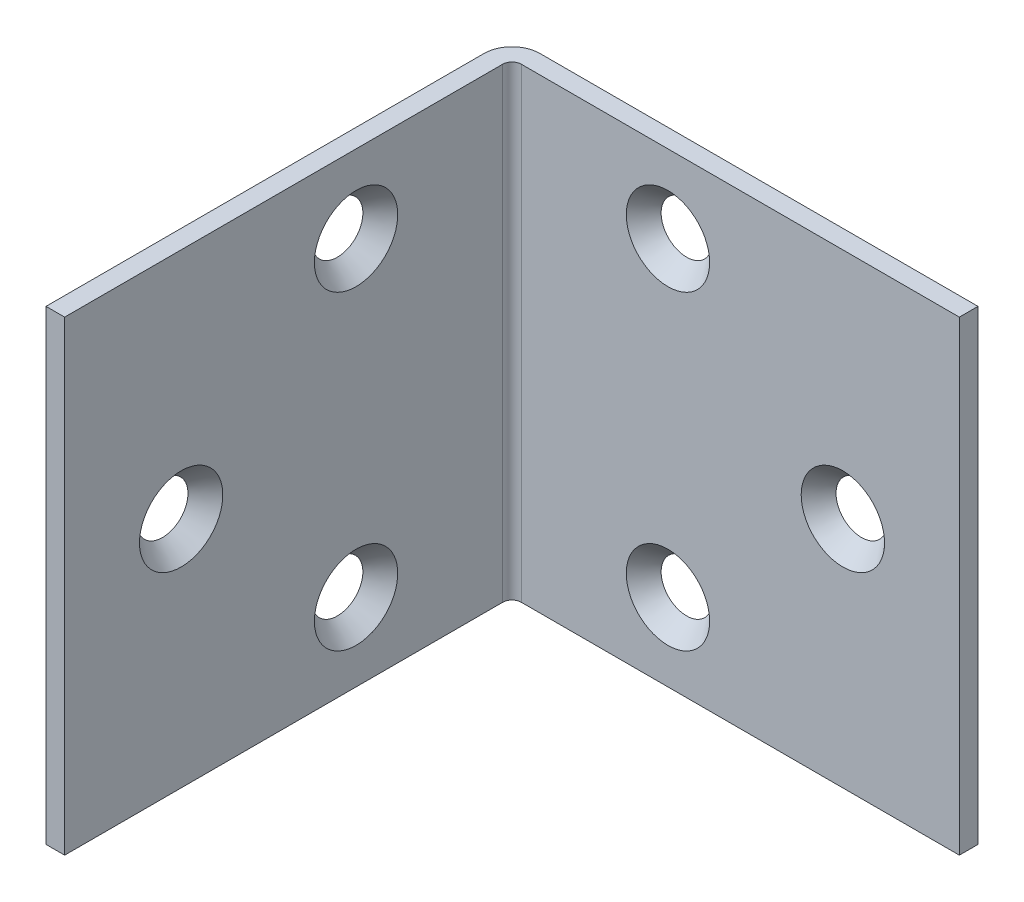
ISO-10303-21;
HEADER;
FILE_DESCRIPTION(('STEP AP214'),'2;1');
FILE_NAME('part.step','',(''),(''),'','','');
FILE_SCHEMA(('AUTOMOTIVE_DESIGN { 1 0 10303 214 1 1 1 1 }'));
ENDSEC;
DATA;
#1=APPLICATION_CONTEXT('core data for automotive mechanical design processes');
#2=APPLICATION_PROTOCOL_DEFINITION('international standard','automotive_design',2000,#1);
#3=PRODUCT_CONTEXT('',#1,'mechanical');
#4=PRODUCT('Part','Part','',(#3));
#5=PRODUCT_RELATED_PRODUCT_CATEGORY('part','',(#4));
#6=PRODUCT_DEFINITION_FORMATION('','',#4);
#7=PRODUCT_DEFINITION_CONTEXT('part definition',#1,'design');
#8=PRODUCT_DEFINITION('design','',#6,#7);
#9=PRODUCT_DEFINITION_SHAPE('','',#8);
#10=(LENGTH_UNIT() NAMED_UNIT(*) SI_UNIT(.MILLI.,.METRE.));
#11=(NAMED_UNIT(*) PLANE_ANGLE_UNIT() SI_UNIT($,.RADIAN.));
#12=(NAMED_UNIT(*) SI_UNIT($,.STERADIAN.) SOLID_ANGLE_UNIT());
#13=UNCERTAINTY_MEASURE_WITH_UNIT(LENGTH_MEASURE(1.E-05),#10,'distance_accuracy_value','');
#14=(GEOMETRIC_REPRESENTATION_CONTEXT(3) GLOBAL_UNCERTAINTY_ASSIGNED_CONTEXT((#13)) GLOBAL_UNIT_ASSIGNED_CONTEXT((#10,
#11,#12)) REPRESENTATION_CONTEXT('',''));
#15=CARTESIAN_POINT('',(0.,0.,0.));
#16=DIRECTION('',(0.,0.,1.));
#17=DIRECTION('',(1.,0.,0.));
#18=AXIS2_PLACEMENT_3D('',#15,#16,#17);
#19=CARTESIAN_POINT('',(2.286,19.05,1.524));
#20=DIRECTION('',(0.,0.,-1.));
#21=DIRECTION('',(-1.,0.,0.));
#22=AXIS2_PLACEMENT_3D('',#19,#20,#21);
#23=PLANE('',#22);
#24=CARTESIAN_POINT('',(14.2748,12.7,1.524));
#25=DIRECTION('',(0.,0.,-1.));
#26=DIRECTION('',(-1.,0.,0.));
#27=AXIS2_PLACEMENT_3D('',#24,#25,#26);
#28=CIRCLE('',#27,3.40759298843189);
#29=CARTESIAN_POINT('',(10.8672070115681,12.7,1.524));
#30=VERTEX_POINT('',#29);
#31=EDGE_CURVE('E205',#30,#30,#28,.F.);
#32=ORIENTED_EDGE('',*,*,#31,.F.);
#33=EDGE_LOOP('',(#32));
#34=FACE_BOUND('',#33,.T.);
#35=DIRECTION('',(1.,0.,0.));
#36=VECTOR('',#35,1.);
#37=CARTESIAN_POINT('',(2.286,-19.05,1.524));
#38=LINE('',#37,#36);
#39=CARTESIAN_POINT('',(2.286,-19.05,1.524));
#40=VERTEX_POINT('',#39);
#41=CARTESIAN_POINT('',(38.1,-19.05,1.524));
#42=VERTEX_POINT('',#41);
#43=EDGE_CURVE('E133',#40,#42,#38,.T.);
#44=ORIENTED_EDGE('',*,*,#43,.T.);
#45=DIRECTION('',(0.,-1.,0.));
#46=VECTOR('',#45,1.);
#47=CARTESIAN_POINT('',(38.1,19.05,1.524));
#48=LINE('',#47,#46);
#49=CARTESIAN_POINT('',(38.1,19.05,1.524));
#50=VERTEX_POINT('',#49);
#51=EDGE_CURVE('E11',#50,#42,#48,.T.);
#52=ORIENTED_EDGE('',*,*,#51,.F.);
#53=DIRECTION('',(1.,0.,0.));
#54=VECTOR('',#53,1.);
#55=CARTESIAN_POINT('',(2.286,19.05,1.524));
#56=LINE('',#55,#54);
#57=CARTESIAN_POINT('',(2.286,19.05,1.524));
#58=VERTEX_POINT('',#57);
#59=EDGE_CURVE('E91',#58,#50,#56,.T.);
#60=ORIENTED_EDGE('',*,*,#59,.F.);
#61=DIRECTION('',(0.,-1.,0.));
#62=VECTOR('',#61,1.);
#63=CARTESIAN_POINT('',(2.286,19.05,1.524));
#64=LINE('',#63,#62);
#65=EDGE_CURVE('E132',#58,#40,#64,.T.);
#66=ORIENTED_EDGE('',*,*,#65,.T.);
#67=EDGE_LOOP('',(#44,#52,#60,#66));
#68=FACE_BOUND('',#67,.T.);
#69=CARTESIAN_POINT('',(14.2748,-12.7,1.524));
#70=DIRECTION('',(0.,0.,-1.));
#71=DIRECTION('',(-1.,0.,0.));
#72=AXIS2_PLACEMENT_3D('',#69,#70,#71);
#73=CIRCLE('',#72,3.40759298843189);
#74=CARTESIAN_POINT('',(10.8672070115681,-12.7,1.524));
#75=VERTEX_POINT('',#74);
#76=EDGE_CURVE('E199',#75,#75,#73,.F.);
#77=ORIENTED_EDGE('',*,*,#76,.F.);
#78=EDGE_LOOP('',(#77));
#79=FACE_BOUND('',#78,.T.);
#80=CARTESIAN_POINT('',(28.575,0.,1.524));
#81=DIRECTION('',(0.,0.,-1.));
#82=DIRECTION('',(-1.,0.,0.));
#83=AXIS2_PLACEMENT_3D('',#80,#81,#82);
#84=CIRCLE('',#83,3.40759298843185);
#85=CARTESIAN_POINT('',(25.1674070115681,0.,1.524));
#86=VERTEX_POINT('',#85);
#87=EDGE_CURVE('E211',#86,#86,#84,.F.);
#88=ORIENTED_EDGE('',*,*,#87,.F.);
#89=EDGE_LOOP('',(#88));
#90=FACE_BOUND('',#89,.T.);
#91=ADVANCED_FACE('F36',(#34,#68,#79,#90),#23,.F.);
#92=CARTESIAN_POINT('',(2.286,19.05,0.));
#93=DIRECTION('',(0.,0.,-1.));
#94=DIRECTION('',(-1.,0.,0.));
#95=AXIS2_PLACEMENT_3D('',#92,#93,#94);
#96=PLANE('',#95);
#97=CARTESIAN_POINT('',(14.2748,12.7,0.));
#98=DIRECTION('',(0.,0.,1.));
#99=DIRECTION('',(1.,0.,0.));
#100=AXIS2_PLACEMENT_3D('',#97,#98,#99);
#101=CIRCLE('',#100,2.0828);
#102=CARTESIAN_POINT('',(16.3576,12.7,0.));
#103=VERTEX_POINT('',#102);
#104=EDGE_CURVE('E208',#103,#103,#101,.T.);
#105=ORIENTED_EDGE('',*,*,#104,.T.);
#106=EDGE_LOOP('',(#105));
#107=FACE_BOUND('',#106,.T.);
#108=DIRECTION('',(1.,0.,0.));
#109=VECTOR('',#108,1.);
#110=CARTESIAN_POINT('',(2.286,-19.05,0.));
#111=LINE('',#110,#109);
#112=CARTESIAN_POINT('',(2.286,-19.05,0.));
#113=VERTEX_POINT('',#112);
#114=CARTESIAN_POINT('',(38.1,-19.05,0.));
#115=VERTEX_POINT('',#114);
#116=EDGE_CURVE('E140',#113,#115,#111,.T.);
#117=ORIENTED_EDGE('',*,*,#116,.F.);
#118=DIRECTION('',(0.,-1.,0.));
#119=VECTOR('',#118,1.);
#120=CARTESIAN_POINT('',(2.286,19.05,0.));
#121=LINE('',#120,#119);
#122=CARTESIAN_POINT('',(2.286,19.05,0.));
#123=VERTEX_POINT('',#122);
#124=EDGE_CURVE('E157',#123,#113,#121,.T.);
#125=ORIENTED_EDGE('',*,*,#124,.F.);
#126=DIRECTION('',(1.,0.,0.));
#127=VECTOR('',#126,1.);
#128=CARTESIAN_POINT('',(2.286,19.05,0.));
#129=LINE('',#128,#127);
#130=CARTESIAN_POINT('',(38.1,19.05,0.));
#131=VERTEX_POINT('',#130);
#132=EDGE_CURVE('E165',#123,#131,#129,.T.);
#133=ORIENTED_EDGE('',*,*,#132,.T.);
#134=DIRECTION('',(0.,-1.,0.));
#135=VECTOR('',#134,1.);
#136=CARTESIAN_POINT('',(38.1,19.05,0.));
#137=LINE('',#136,#135);
#138=EDGE_CURVE('E44',#131,#115,#137,.T.);
#139=ORIENTED_EDGE('',*,*,#138,.T.);
#140=EDGE_LOOP('',(#117,#125,#133,#139));
#141=FACE_BOUND('',#140,.T.);
#142=CARTESIAN_POINT('',(28.575,0.,0.));
#143=DIRECTION('',(0.,0.,1.));
#144=DIRECTION('',(1.,0.,0.));
#145=AXIS2_PLACEMENT_3D('',#142,#143,#144);
#146=CIRCLE('',#145,2.0828);
#147=CARTESIAN_POINT('',(30.6578,0.,1.02110986333059E-13));
#148=VERTEX_POINT('',#147);
#149=EDGE_CURVE('E214',#148,#148,#146,.T.);
#150=ORIENTED_EDGE('',*,*,#149,.T.);
#151=EDGE_LOOP('',(#150));
#152=FACE_BOUND('',#151,.T.);
#153=CARTESIAN_POINT('',(14.2748,-12.7,0.));
#154=DIRECTION('',(0.,0.,1.));
#155=DIRECTION('',(1.,0.,0.));
#156=AXIS2_PLACEMENT_3D('',#153,#154,#155);
#157=CIRCLE('',#156,2.0828);
#158=CARTESIAN_POINT('',(16.3576,-12.7,0.));
#159=VERTEX_POINT('',#158);
#160=EDGE_CURVE('E202',#159,#159,#157,.T.);
#161=ORIENTED_EDGE('',*,*,#160,.T.);
#162=EDGE_LOOP('',(#161));
#163=FACE_BOUND('',#162,.T.);
#164=ADVANCED_FACE('F162',(#107,#141,#152,#163),#96,.T.);
#165=CARTESIAN_POINT('',(38.1,19.05,0.));
#166=DIRECTION('',(1.,0.,0.));
#167=DIRECTION('',(0.,0.,-1.));
#168=AXIS2_PLACEMENT_3D('',#165,#166,#167);
#169=PLANE('',#168);
#170=DIRECTION('',(0.,0.,1.));
#171=VECTOR('',#170,1.);
#172=CARTESIAN_POINT('',(38.1,-19.05,0.));
#173=LINE('',#172,#171);
#174=EDGE_CURVE('E136',#115,#42,#173,.T.);
#175=ORIENTED_EDGE('',*,*,#174,.F.);
#176=ORIENTED_EDGE('',*,*,#138,.F.);
#177=DIRECTION('',(0.,0.,1.));
#178=VECTOR('',#177,1.);
#179=CARTESIAN_POINT('',(38.1,19.05,0.));
#180=LINE('',#179,#178);
#181=EDGE_CURVE('E177',#131,#50,#180,.T.);
#182=ORIENTED_EDGE('',*,*,#181,.T.);
#183=ORIENTED_EDGE('',*,*,#51,.T.);
#184=EDGE_LOOP('',(#175,#176,#182,#183));
#185=FACE_BOUND('',#184,.T.);
#186=ADVANCED_FACE('F168',(#185),#169,.T.);
#187=CARTESIAN_POINT('',(2.286,19.05,2.286));
#188=DIRECTION('',(0.,-1.,0.));
#189=DIRECTION('',(0.,0.,-1.));
#190=AXIS2_PLACEMENT_3D('',#187,#188,#189);
#191=CYLINDRICAL_SURFACE('',#190,2.286);
#192=CARTESIAN_POINT('',(2.286,-19.05,2.286));
#193=DIRECTION('',(0.,-1.,0.));
#194=DIRECTION('',(0.,0.,1.));
#195=AXIS2_PLACEMENT_3D('',#192,#193,#194);
#196=CIRCLE('',#195,2.286);
#197=CARTESIAN_POINT('',(0.,-19.05,2.286));
#198=VERTEX_POINT('',#197);
#199=EDGE_CURVE('E143',#198,#113,#196,.T.);
#200=ORIENTED_EDGE('',*,*,#199,.F.);
#201=DIRECTION('',(0.,-1.,0.));
#202=VECTOR('',#201,1.);
#203=CARTESIAN_POINT('',(0.,19.05,2.286));
#204=LINE('',#203,#202);
#205=CARTESIAN_POINT('',(0.,19.05,2.286));
#206=VERTEX_POINT('',#205);
#207=EDGE_CURVE('E155',#206,#198,#204,.T.);
#208=ORIENTED_EDGE('',*,*,#207,.F.);
#209=CARTESIAN_POINT('',(2.286,19.05,2.286));
#210=DIRECTION('',(0.,-1.,0.));
#211=DIRECTION('',(0.,0.,1.));
#212=AXIS2_PLACEMENT_3D('',#209,#210,#211);
#213=CIRCLE('',#212,2.286);
#214=EDGE_CURVE('E127',#206,#123,#213,.T.);
#215=ORIENTED_EDGE('',*,*,#214,.T.);
#216=ORIENTED_EDGE('',*,*,#124,.T.);
#217=EDGE_LOOP('',(#200,#208,#215,#216));
#218=FACE_BOUND('',#217,.T.);
#219=ADVANCED_FACE('F175',(#218),#191,.T.);
#220=CARTESIAN_POINT('',(0.,19.05,38.1));
#221=DIRECTION('',(-1.,0.,0.));
#222=DIRECTION('',(0.,0.,1.));
#223=AXIS2_PLACEMENT_3D('',#220,#221,#222);
#224=PLANE('',#223);
#225=CARTESIAN_POINT('',(0.,-12.7,14.2748));
#226=DIRECTION('',(-1.,0.,0.));
#227=DIRECTION('',(0.,0.,1.));
#228=AXIS2_PLACEMENT_3D('',#225,#226,#227);
#229=CIRCLE('',#228,2.0828);
#230=CARTESIAN_POINT('',(0.,-12.7,16.3576));
#231=VERTEX_POINT('',#230);
#232=EDGE_CURVE('E184',#231,#231,#229,.T.);
#233=ORIENTED_EDGE('',*,*,#232,.F.);
#234=EDGE_LOOP('',(#233));
#235=FACE_BOUND('',#234,.T.);
#236=CARTESIAN_POINT('',(0.,12.7,14.2748));
#237=DIRECTION('',(-1.,0.,0.));
#238=DIRECTION('',(0.,0.,1.));
#239=AXIS2_PLACEMENT_3D('',#236,#237,#238);
#240=CIRCLE('',#239,2.0828);
#241=CARTESIAN_POINT('',(0.,12.7,16.3576));
#242=VERTEX_POINT('',#241);
#243=EDGE_CURVE('E190',#242,#242,#240,.T.);
#244=ORIENTED_EDGE('',*,*,#243,.F.);
#245=EDGE_LOOP('',(#244));
#246=FACE_BOUND('',#245,.T.);
#247=CARTESIAN_POINT('',(0.,0.,28.575));
#248=DIRECTION('',(-1.,0.,0.));
#249=DIRECTION('',(0.,0.,1.));
#250=AXIS2_PLACEMENT_3D('',#247,#248,#249);
#251=CIRCLE('',#250,2.0828);
#252=CARTESIAN_POINT('',(0.,0.,30.6578));
#253=VERTEX_POINT('',#252);
#254=EDGE_CURVE('E196',#253,#253,#251,.T.);
#255=ORIENTED_EDGE('',*,*,#254,.F.);
#256=EDGE_LOOP('',(#255));
#257=FACE_BOUND('',#256,.T.);
#258=DIRECTION('',(0.,0.,-1.));
#259=VECTOR('',#258,1.);
#260=CARTESIAN_POINT('',(0.,-19.05,38.1));
#261=LINE('',#260,#259);
#262=CARTESIAN_POINT('',(0.,-19.05,38.1));
#263=VERTEX_POINT('',#262);
#264=EDGE_CURVE('E146',#263,#198,#261,.T.);
#265=ORIENTED_EDGE('',*,*,#264,.F.);
#266=DIRECTION('',(0.,-1.,0.));
#267=VECTOR('',#266,1.);
#268=CARTESIAN_POINT('',(0.,19.05,38.1));
#269=LINE('',#268,#267);
#270=CARTESIAN_POINT('',(0.,19.05,38.1));
#271=VERTEX_POINT('',#270);
#272=EDGE_CURVE('E115',#271,#263,#269,.T.);
#273=ORIENTED_EDGE('',*,*,#272,.F.);
#274=DIRECTION('',(0.,0.,-1.));
#275=VECTOR('',#274,1.);
#276=CARTESIAN_POINT('',(0.,19.05,38.1));
#277=LINE('',#276,#275);
#278=EDGE_CURVE('E125',#271,#206,#277,.T.);
#279=ORIENTED_EDGE('',*,*,#278,.T.);
#280=ORIENTED_EDGE('',*,*,#207,.T.);
#281=EDGE_LOOP('',(#265,#273,#279,#280));
#282=FACE_BOUND('',#281,.T.);
#283=ADVANCED_FACE('F273',(#235,#246,#257,#282),#224,.T.);
#284=CARTESIAN_POINT('',(1.524,19.05,38.1));
#285=DIRECTION('',(0.,0.,1.));
#286=DIRECTION('',(1.,0.,0.));
#287=AXIS2_PLACEMENT_3D('',#284,#285,#286);
#288=PLANE('',#287);
#289=DIRECTION('',(-1.,0.,0.));
#290=VECTOR('',#289,1.);
#291=CARTESIAN_POINT('',(1.524,-19.05,38.1));
#292=LINE('',#291,#290);
#293=CARTESIAN_POINT('',(1.524,-19.05,38.1));
#294=VERTEX_POINT('',#293);
#295=EDGE_CURVE('E114',#294,#263,#292,.T.);
#296=ORIENTED_EDGE('',*,*,#295,.F.);
#297=DIRECTION('',(0.,-1.,0.));
#298=VECTOR('',#297,1.);
#299=CARTESIAN_POINT('',(1.524,19.05,38.1));
#300=LINE('',#299,#298);
#301=CARTESIAN_POINT('',(1.524,19.05,38.1));
#302=VERTEX_POINT('',#301);
#303=EDGE_CURVE('E108',#302,#294,#300,.T.);
#304=ORIENTED_EDGE('',*,*,#303,.F.);
#305=DIRECTION('',(-1.,0.,0.));
#306=VECTOR('',#305,1.);
#307=CARTESIAN_POINT('',(1.524,19.05,38.1));
#308=LINE('',#307,#306);
#309=EDGE_CURVE('E112',#302,#271,#308,.T.);
#310=ORIENTED_EDGE('',*,*,#309,.T.);
#311=ORIENTED_EDGE('',*,*,#272,.T.);
#312=EDGE_LOOP('',(#296,#304,#310,#311));
#313=FACE_BOUND('',#312,.T.);
#314=ADVANCED_FACE('F110',(#313),#288,.T.);
#315=CARTESIAN_POINT('',(1.524,19.05,38.1));
#316=DIRECTION('',(-1.,0.,0.));
#317=DIRECTION('',(0.,0.,1.));
#318=AXIS2_PLACEMENT_3D('',#315,#316,#317);
#319=PLANE('',#318);
#320=CARTESIAN_POINT('',(1.524,0.,28.575));
#321=DIRECTION('',(-1.,0.,0.));
#322=DIRECTION('',(0.,0.,1.));
#323=AXIS2_PLACEMENT_3D('',#320,#321,#322);
#324=CIRCLE('',#323,3.40759298843193);
#325=CARTESIAN_POINT('',(1.524,0.,31.9825929884319));
#326=VERTEX_POINT('',#325);
#327=EDGE_CURVE('E193',#326,#326,#324,.T.);
#328=ORIENTED_EDGE('',*,*,#327,.T.);
#329=EDGE_LOOP('',(#328));
#330=FACE_BOUND('',#329,.T.);
#331=CARTESIAN_POINT('',(1.524,12.7,14.2748));
#332=DIRECTION('',(-1.,0.,0.));
#333=DIRECTION('',(0.,0.,1.));
#334=AXIS2_PLACEMENT_3D('',#331,#332,#333);
#335=CIRCLE('',#334,3.40759298843193);
#336=CARTESIAN_POINT('',(1.524,12.7,17.6823929884319));
#337=VERTEX_POINT('',#336);
#338=EDGE_CURVE('E187',#337,#337,#335,.T.);
#339=ORIENTED_EDGE('',*,*,#338,.T.);
#340=EDGE_LOOP('',(#339));
#341=FACE_BOUND('',#340,.T.);
#342=CARTESIAN_POINT('',(1.524,-12.7,14.2748));
#343=DIRECTION('',(-1.,0.,0.));
#344=DIRECTION('',(0.,0.,1.));
#345=AXIS2_PLACEMENT_3D('',#342,#343,#344);
#346=CIRCLE('',#345,3.40759298843193);
#347=CARTESIAN_POINT('',(1.524,-12.7,17.6823929884319));
#348=VERTEX_POINT('',#347);
#349=EDGE_CURVE('E137',#348,#348,#346,.T.);
#350=ORIENTED_EDGE('',*,*,#349,.T.);
#351=EDGE_LOOP('',(#350));
#352=FACE_BOUND('',#351,.T.);
#353=DIRECTION('',(0.,0.,-1.));
#354=VECTOR('',#353,1.);
#355=CARTESIAN_POINT('',(1.524,-19.05,38.1));
#356=LINE('',#355,#354);
#357=CARTESIAN_POINT('',(1.524,-19.05,2.286));
#358=VERTEX_POINT('',#357);
#359=EDGE_CURVE('E79',#294,#358,#356,.T.);
#360=ORIENTED_EDGE('',*,*,#359,.T.);
#361=DIRECTION('',(0.,-1.,0.));
#362=VECTOR('',#361,1.);
#363=CARTESIAN_POINT('',(1.524,19.05,2.286));
#364=LINE('',#363,#362);
#365=CARTESIAN_POINT('',(1.524,19.05,2.286));
#366=VERTEX_POINT('',#365);
#367=EDGE_CURVE('E116',#366,#358,#364,.T.);
#368=ORIENTED_EDGE('',*,*,#367,.F.);
#369=DIRECTION('',(0.,0.,-1.));
#370=VECTOR('',#369,1.);
#371=CARTESIAN_POINT('',(1.524,19.05,38.1));
#372=LINE('',#371,#370);
#373=EDGE_CURVE('E118',#302,#366,#372,.T.);
#374=ORIENTED_EDGE('',*,*,#373,.F.);
#375=ORIENTED_EDGE('',*,*,#303,.T.);
#376=EDGE_LOOP('',(#360,#368,#374,#375));
#377=FACE_BOUND('',#376,.T.);
#378=ADVANCED_FACE('F119',(#330,#341,#352,#377),#319,.F.);
#379=CARTESIAN_POINT('',(2.286,19.05,2.286));
#380=DIRECTION('',(0.,-1.,0.));
#381=DIRECTION('',(0.,0.,-1.));
#382=AXIS2_PLACEMENT_3D('',#379,#380,#381);
#383=CYLINDRICAL_SURFACE('',#382,0.762);
#384=CARTESIAN_POINT('',(2.286,-19.05,2.286));
#385=DIRECTION('',(0.,1.,0.));
#386=DIRECTION('',(1.,0.,0.));
#387=AXIS2_PLACEMENT_3D('',#384,#385,#386);
#388=CIRCLE('',#387,0.762);
#389=EDGE_CURVE('E85',#358,#40,#388,.F.);
#390=ORIENTED_EDGE('',*,*,#389,.T.);
#391=ORIENTED_EDGE('',*,*,#65,.F.);
#392=CARTESIAN_POINT('',(2.286,19.05,2.286));
#393=DIRECTION('',(0.,1.,0.));
#394=DIRECTION('',(1.,0.,0.));
#395=AXIS2_PLACEMENT_3D('',#392,#393,#394);
#396=CIRCLE('',#395,0.762);
#397=EDGE_CURVE('E52',#366,#58,#396,.F.);
#398=ORIENTED_EDGE('',*,*,#397,.F.);
#399=ORIENTED_EDGE('',*,*,#367,.T.);
#400=EDGE_LOOP('',(#390,#391,#398,#399));
#401=FACE_BOUND('',#400,.T.);
#402=ADVANCED_FACE('F263',(#401),#383,.F.);
#403=CARTESIAN_POINT('',(2.286,19.05,2.286));
#404=DIRECTION('',(0.,-1.,0.));
#405=DIRECTION('',(-1.,0.,0.));
#406=AXIS2_PLACEMENT_3D('',#403,#404,#405);
#407=PLANE('',#406);
#408=ORIENTED_EDGE('',*,*,#59,.T.);
#409=ORIENTED_EDGE('',*,*,#181,.F.);
#410=ORIENTED_EDGE('',*,*,#132,.F.);
#411=ORIENTED_EDGE('',*,*,#214,.F.);
#412=ORIENTED_EDGE('',*,*,#278,.F.);
#413=ORIENTED_EDGE('',*,*,#309,.F.);
#414=ORIENTED_EDGE('',*,*,#373,.T.);
#415=ORIENTED_EDGE('',*,*,#397,.T.);
#416=EDGE_LOOP('',(#408,#409,#410,#411,#412,#413,#414,#415));
#417=FACE_BOUND('',#416,.T.);
#418=ADVANCED_FACE('F122',(#417),#407,.F.);
#419=CARTESIAN_POINT('',(2.286,-19.05,2.286));
#420=DIRECTION('',(0.,-1.,0.));
#421=DIRECTION('',(-1.,0.,0.));
#422=AXIS2_PLACEMENT_3D('',#419,#420,#421);
#423=PLANE('',#422);
#424=ORIENTED_EDGE('',*,*,#43,.F.);
#425=ORIENTED_EDGE('',*,*,#389,.F.);
#426=ORIENTED_EDGE('',*,*,#359,.F.);
#427=ORIENTED_EDGE('',*,*,#295,.T.);
#428=ORIENTED_EDGE('',*,*,#264,.T.);
#429=ORIENTED_EDGE('',*,*,#199,.T.);
#430=ORIENTED_EDGE('',*,*,#116,.T.);
#431=ORIENTED_EDGE('',*,*,#174,.T.);
#432=EDGE_LOOP('',(#424,#425,#426,#427,#428,#429,#430,#431));
#433=FACE_BOUND('',#432,.T.);
#434=ADVANCED_FACE('F171',(#433),#423,.T.);
#435=CARTESIAN_POINT('',(0.,-12.7,14.2748));
#436=DIRECTION('',(1.,0.,0.));
#437=DIRECTION('',(0.,0.,1.));
#438=AXIS2_PLACEMENT_3D('',#435,#436,#437);
#439=CONICAL_SURFACE('',#438,2.0828,0.715584993317677);
#440=ORIENTED_EDGE('',*,*,#232,.T.);
#441=EDGE_LOOP('',(#440));
#442=FACE_BOUND('',#441,.T.);
#443=ORIENTED_EDGE('',*,*,#349,.F.);
#444=EDGE_LOOP('',(#443));
#445=FACE_BOUND('',#444,.T.);
#446=ADVANCED_FACE('F256',(#442,#445),#439,.F.);
#447=CARTESIAN_POINT('',(0.,12.7,14.2748));
#448=DIRECTION('',(1.,0.,0.));
#449=DIRECTION('',(0.,0.,1.));
#450=AXIS2_PLACEMENT_3D('',#447,#448,#449);
#451=CONICAL_SURFACE('',#450,2.0828,0.715584993317677);
#452=ORIENTED_EDGE('',*,*,#243,.T.);
#453=EDGE_LOOP('',(#452));
#454=FACE_BOUND('',#453,.T.);
#455=ORIENTED_EDGE('',*,*,#338,.F.);
#456=EDGE_LOOP('',(#455));
#457=FACE_BOUND('',#456,.T.);
#458=ADVANCED_FACE('F249',(#454,#457),#451,.F.);
#459=CARTESIAN_POINT('',(0.,0.,28.575));
#460=DIRECTION('',(1.,0.,0.));
#461=DIRECTION('',(0.,0.,1.));
#462=AXIS2_PLACEMENT_3D('',#459,#460,#461);
#463=CONICAL_SURFACE('',#462,2.0828,0.715584993317677);
#464=ORIENTED_EDGE('',*,*,#254,.T.);
#465=EDGE_LOOP('',(#464));
#466=FACE_BOUND('',#465,.T.);
#467=ORIENTED_EDGE('',*,*,#327,.F.);
#468=EDGE_LOOP('',(#467));
#469=FACE_BOUND('',#468,.T.);
#470=ADVANCED_FACE('F240',(#466,#469),#463,.F.);
#471=CARTESIAN_POINT('',(14.2748,-12.7,0.));
#472=DIRECTION('',(0.,0.,1.));
#473=DIRECTION('',(1.,0.,0.));
#474=AXIS2_PLACEMENT_3D('',#471,#472,#473);
#475=CONICAL_SURFACE('',#474,2.0828,0.715584993317677);
#476=ORIENTED_EDGE('',*,*,#160,.F.);
#477=EDGE_LOOP('',(#476));
#478=FACE_BOUND('',#477,.T.);
#479=ORIENTED_EDGE('',*,*,#76,.T.);
#480=EDGE_LOOP('',(#479));
#481=FACE_BOUND('',#480,.T.);
#482=ADVANCED_FACE('F238',(#478,#481),#475,.F.);
#483=CARTESIAN_POINT('',(14.2748,12.7,0.));
#484=DIRECTION('',(0.,0.,1.));
#485=DIRECTION('',(1.,0.,0.));
#486=AXIS2_PLACEMENT_3D('',#483,#484,#485);
#487=CONICAL_SURFACE('',#486,2.0828,0.715584993317677);
#488=ORIENTED_EDGE('',*,*,#104,.F.);
#489=EDGE_LOOP('',(#488));
#490=FACE_BOUND('',#489,.T.);
#491=ORIENTED_EDGE('',*,*,#31,.T.);
#492=EDGE_LOOP('',(#491));
#493=FACE_BOUND('',#492,.T.);
#494=ADVANCED_FACE('F222',(#490,#493),#487,.F.);
#495=CARTESIAN_POINT('',(28.575,0.,0.));
#496=DIRECTION('',(0.,0.,1.));
#497=DIRECTION('',(1.,0.,0.));
#498=AXIS2_PLACEMENT_3D('',#495,#496,#497);
#499=CONICAL_SURFACE('',#498,2.0828,0.715584993317677);
#500=ORIENTED_EDGE('',*,*,#149,.F.);
#501=EDGE_LOOP('',(#500));
#502=FACE_BOUND('',#501,.T.);
#503=ORIENTED_EDGE('',*,*,#87,.T.);
#504=EDGE_LOOP('',(#503));
#505=FACE_BOUND('',#504,.T.);
#506=ADVANCED_FACE('F219',(#502,#505),#499,.F.);
#507=CLOSED_SHELL('',(#91,#164,#186,#219,#283,#314,#378,#402,#418,#434,#446,#458,#470,#482,#494,#506));
#508=MANIFOLD_SOLID_BREP('B2',#507);
#509=ADVANCED_BREP_SHAPE_REPRESENTATION('',(#18,#508),#14);
#510=SHAPE_DEFINITION_REPRESENTATION(#9,#509);
ENDSEC;
END-ISO-10303-21;
